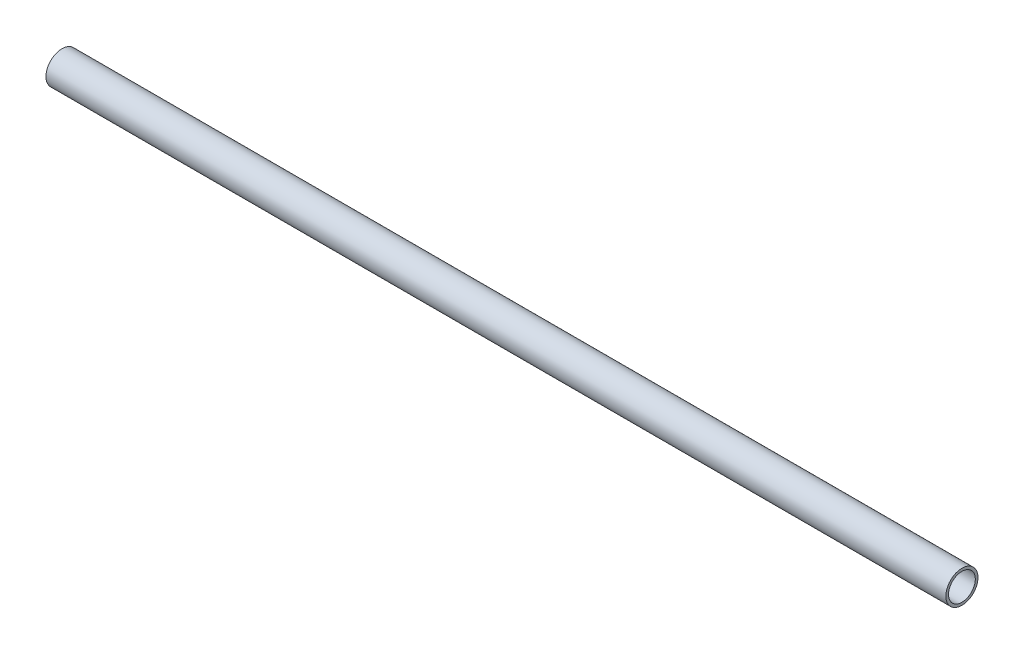
ISO-10303-21;
HEADER;
FILE_DESCRIPTION(('STEP AP214'),'2;1');
FILE_NAME('part.step','',(''),(''),'','','');
FILE_SCHEMA(('AUTOMOTIVE_DESIGN { 1 0 10303 214 1 1 1 1 }'));
ENDSEC;
DATA;
#1=APPLICATION_CONTEXT('core data for automotive mechanical design processes');
#2=APPLICATION_PROTOCOL_DEFINITION('international standard','automotive_design',2000,#1);
#3=PRODUCT_CONTEXT('',#1,'mechanical');
#4=PRODUCT('Part','Part','',(#3));
#5=PRODUCT_RELATED_PRODUCT_CATEGORY('part','',(#4));
#6=PRODUCT_DEFINITION_FORMATION('','',#4);
#7=PRODUCT_DEFINITION_CONTEXT('part definition',#1,'design');
#8=PRODUCT_DEFINITION('design','',#6,#7);
#9=PRODUCT_DEFINITION_SHAPE('','',#8);
#10=(LENGTH_UNIT() NAMED_UNIT(*) SI_UNIT(.MILLI.,.METRE.));
#11=(NAMED_UNIT(*) PLANE_ANGLE_UNIT() SI_UNIT($,.RADIAN.));
#12=(NAMED_UNIT(*) SI_UNIT($,.STERADIAN.) SOLID_ANGLE_UNIT());
#13=UNCERTAINTY_MEASURE_WITH_UNIT(LENGTH_MEASURE(1.E-05),#10,'distance_accuracy_value','');
#14=(GEOMETRIC_REPRESENTATION_CONTEXT(3) GLOBAL_UNCERTAINTY_ASSIGNED_CONTEXT((#13)) GLOBAL_UNIT_ASSIGNED_CONTEXT((#10,
#11,#12)) REPRESENTATION_CONTEXT('',''));
#15=CARTESIAN_POINT('',(0.,0.,0.));
#16=DIRECTION('',(0.,0.,1.));
#17=DIRECTION('',(1.,0.,0.));
#18=AXIS2_PLACEMENT_3D('',#15,#16,#17);
#19=CARTESIAN_POINT('',(-533.4,-450.85,1109.726));
#20=DIRECTION('',(1.,0.,0.));
#21=DIRECTION('',(0.,0.,-1.));
#22=AXIS2_PLACEMENT_3D('',#19,#20,#21);
#23=CYLINDRICAL_SURFACE('',#22,15.875);
#24=CARTESIAN_POINT('',(533.4,-450.85,1109.726));
#25=DIRECTION('',(1.,0.,0.));
#26=DIRECTION('',(0.,0.,-1.));
#27=AXIS2_PLACEMENT_3D('',#24,#25,#26);
#28=CIRCLE('',#27,15.875);
#29=CARTESIAN_POINT('',(533.4,-450.85,1093.851));
#30=VERTEX_POINT('',#29);
#31=EDGE_CURVE('E17',#30,#30,#28,.F.);
#32=ORIENTED_EDGE('',*,*,#31,.F.);
#33=EDGE_LOOP('',(#32));
#34=FACE_BOUND('',#33,.T.);
#35=CARTESIAN_POINT('',(-533.4,-450.85,1109.726));
#36=DIRECTION('',(1.,0.,0.));
#37=DIRECTION('',(0.,0.,-1.));
#38=AXIS2_PLACEMENT_3D('',#35,#36,#37);
#39=CIRCLE('',#38,15.875);
#40=CARTESIAN_POINT('',(-533.4,-450.85,1093.851));
#41=VERTEX_POINT('',#40);
#42=EDGE_CURVE('E26',#41,#41,#39,.F.);
#43=ORIENTED_EDGE('',*,*,#42,.T.);
#44=EDGE_LOOP('',(#43));
#45=FACE_BOUND('',#44,.T.);
#46=ADVANCED_FACE('F14',(#34,#45),#23,.F.);
#47=CARTESIAN_POINT('',(533.4,0.,0.));
#48=DIRECTION('',(1.,0.,0.));
#49=DIRECTION('',(0.,0.,-1.));
#50=AXIS2_PLACEMENT_3D('',#47,#48,#49);
#51=PLANE('',#50);
#52=ORIENTED_EDGE('',*,*,#31,.T.);
#53=EDGE_LOOP('',(#52));
#54=FACE_BOUND('',#53,.T.);
#55=CARTESIAN_POINT('',(533.4,-450.85,1109.726));
#56=DIRECTION('',(1.,0.,0.));
#57=DIRECTION('',(0.,0.,-1.));
#58=AXIS2_PLACEMENT_3D('',#55,#56,#57);
#59=CIRCLE('',#58,19.05);
#60=CARTESIAN_POINT('',(533.4,-450.85,1090.676));
#61=VERTEX_POINT('',#60);
#62=EDGE_CURVE('E21',#61,#61,#59,.F.);
#63=ORIENTED_EDGE('',*,*,#62,.F.);
#64=EDGE_LOOP('',(#63));
#65=FACE_BOUND('',#64,.T.);
#66=ADVANCED_FACE('F34',(#54,#65),#51,.T.);
#67=CARTESIAN_POINT('',(-533.4,0.,0.));
#68=DIRECTION('',(1.,0.,0.));
#69=DIRECTION('',(0.,0.,-1.));
#70=AXIS2_PLACEMENT_3D('',#67,#68,#69);
#71=PLANE('',#70);
#72=ORIENTED_EDGE('',*,*,#42,.F.);
#73=EDGE_LOOP('',(#72));
#74=FACE_BOUND('',#73,.T.);
#75=CARTESIAN_POINT('',(-533.4,-450.85,1109.726));
#76=DIRECTION('',(1.,0.,0.));
#77=DIRECTION('',(0.,0.,-1.));
#78=AXIS2_PLACEMENT_3D('',#75,#76,#77);
#79=CIRCLE('',#78,19.05);
#80=CARTESIAN_POINT('',(-533.4,-450.85,1090.676));
#81=VERTEX_POINT('',#80);
#82=EDGE_CURVE('E10',#81,#81,#79,.T.);
#83=ORIENTED_EDGE('',*,*,#82,.F.);
#84=EDGE_LOOP('',(#83));
#85=FACE_BOUND('',#84,.T.);
#86=ADVANCED_FACE('F42',(#74,#85),#71,.F.);
#87=CARTESIAN_POINT('',(-533.4,-450.85,1109.726));
#88=DIRECTION('',(1.,0.,0.));
#89=DIRECTION('',(0.,0.,-1.));
#90=AXIS2_PLACEMENT_3D('',#87,#88,#89);
#91=CYLINDRICAL_SURFACE('',#90,19.05);
#92=ORIENTED_EDGE('',*,*,#62,.T.);
#93=EDGE_LOOP('',(#92));
#94=FACE_BOUND('',#93,.T.);
#95=ORIENTED_EDGE('',*,*,#82,.T.);
#96=EDGE_LOOP('',(#95));
#97=FACE_BOUND('',#96,.T.);
#98=ADVANCED_FACE('F43',(#94,#97),#91,.T.);
#99=CLOSED_SHELL('',(#46,#66,#86,#98));
#100=MANIFOLD_SOLID_BREP('B1',#99);
#101=ADVANCED_BREP_SHAPE_REPRESENTATION('',(#18,#100),#14);
#102=SHAPE_DEFINITION_REPRESENTATION(#9,#101);
ENDSEC;
END-ISO-10303-21;
